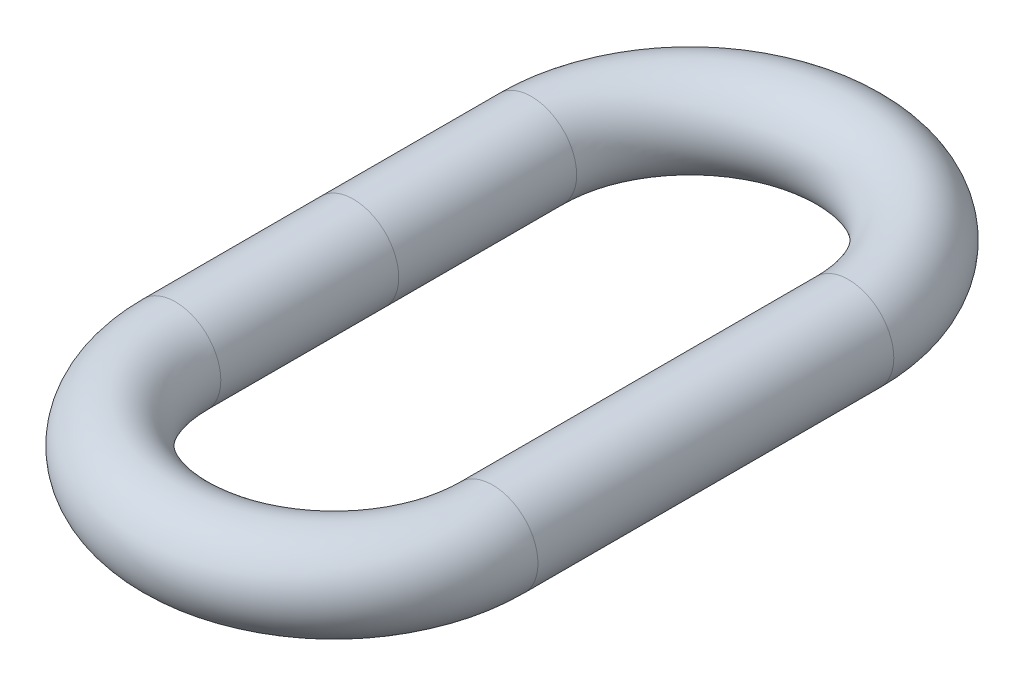
ISO-10303-21;
HEADER;
FILE_DESCRIPTION(('STEP AP214'),'2;1');
FILE_NAME('part.step','',(''),(''),'','','');
FILE_SCHEMA(('AUTOMOTIVE_DESIGN { 1 0 10303 214 1 1 1 1 }'));
ENDSEC;
DATA;
#1=APPLICATION_CONTEXT('core data for automotive mechanical design processes');
#2=APPLICATION_PROTOCOL_DEFINITION('international standard','automotive_design',2000,#1);
#3=PRODUCT_CONTEXT('',#1,'mechanical');
#4=PRODUCT('Part','Part','',(#3));
#5=PRODUCT_RELATED_PRODUCT_CATEGORY('part','',(#4));
#6=PRODUCT_DEFINITION_FORMATION('','',#4);
#7=PRODUCT_DEFINITION_CONTEXT('part definition',#1,'design');
#8=PRODUCT_DEFINITION('design','',#6,#7);
#9=PRODUCT_DEFINITION_SHAPE('','',#8);
#10=(LENGTH_UNIT() NAMED_UNIT(*) SI_UNIT(.MILLI.,.METRE.));
#11=(NAMED_UNIT(*) PLANE_ANGLE_UNIT() SI_UNIT($,.RADIAN.));
#12=(NAMED_UNIT(*) SI_UNIT($,.STERADIAN.) SOLID_ANGLE_UNIT());
#13=UNCERTAINTY_MEASURE_WITH_UNIT(LENGTH_MEASURE(1.E-05),#10,'distance_accuracy_value','');
#14=(GEOMETRIC_REPRESENTATION_CONTEXT(3) GLOBAL_UNCERTAINTY_ASSIGNED_CONTEXT((#13)) GLOBAL_UNIT_ASSIGNED_CONTEXT((#10,
#11,#12)) REPRESENTATION_CONTEXT('',''));
#15=CARTESIAN_POINT('',(0.,0.,0.));
#16=DIRECTION('',(0.,0.,1.));
#17=DIRECTION('',(1.,0.,0.));
#18=AXIS2_PLACEMENT_3D('',#15,#16,#17);
#19=CARTESIAN_POINT('',(-88.9,25.4,-99.7453308473433));
#20=DIRECTION('',(0.,0.,1.));
#21=DIRECTION('',(1.,0.,0.));
#22=AXIS2_PLACEMENT_3D('',#19,#20,#21);
#23=CYLINDRICAL_SURFACE('',#22,25.4);
#24=CARTESIAN_POINT('',(-88.9,25.4,0.));
#25=DIRECTION('',(0.,0.,1.));
#26=DIRECTION('',(1.,0.,0.));
#27=AXIS2_PLACEMENT_3D('',#24,#25,#26);
#28=CIRCLE('',#27,25.4);
#29=CARTESIAN_POINT('',(-63.5,25.4,0.));
#30=VERTEX_POINT('',#29);
#31=EDGE_CURVE('E56',#30,#30,#28,.T.);
#32=ORIENTED_EDGE('',*,*,#31,.F.);
#33=EDGE_LOOP('',(#32));
#34=FACE_BOUND('',#33,.T.);
#35=CARTESIAN_POINT('',(-88.9,25.4,-99.7453308473433));
#36=DIRECTION('',(0.,0.,1.));
#37=DIRECTION('',(1.,0.,0.));
#38=AXIS2_PLACEMENT_3D('',#35,#36,#37);
#39=CIRCLE('',#38,25.4);
#40=CARTESIAN_POINT('',(-114.3,25.4,-99.7453308473433));
#41=VERTEX_POINT('',#40);
#42=EDGE_CURVE('E10',#41,#41,#39,.T.);
#43=ORIENTED_EDGE('',*,*,#42,.T.);
#44=EDGE_LOOP('',(#43));
#45=FACE_BOUND('',#44,.T.);
#46=ADVANCED_FACE('F37',(#34,#45),#23,.T.);
#47=CARTESIAN_POINT('',(0.,25.4,-99.7453308473433));
#48=DIRECTION('',(0.,1.,0.));
#49=DIRECTION('',(0.,0.,1.));
#50=AXIS2_PLACEMENT_3D('',#47,#48,#49);
#51=TOROIDAL_SURFACE('',#50,88.9,25.4);
#52=CARTESIAN_POINT('',(88.9,25.4,-99.7453308473432));
#53=DIRECTION('',(0.,0.,-1.));
#54=DIRECTION('',(-1.,0.,0.));
#55=AXIS2_PLACEMENT_3D('',#52,#53,#54);
#56=CIRCLE('',#55,25.4);
#57=CARTESIAN_POINT('',(114.3,25.4,-99.7453308473432));
#58=VERTEX_POINT('',#57);
#59=EDGE_CURVE('E43',#58,#58,#56,.T.);
#60=CARTESIAN_POINT('',(0.,25.4,-99.7453308473433));
#61=DIRECTION('',(0.,1.,0.));
#62=DIRECTION('',(0.,0.,1.));
#63=AXIS2_PLACEMENT_3D('',#60,#61,#62);
#64=CIRCLE('',#63,114.3);
#65=EDGE_CURVE('',#58,#41,#64,.T.);
#66=ORIENTED_EDGE('',*,*,#59,.T.);
#67=ORIENTED_EDGE('',*,*,#42,.F.);
#68=ORIENTED_EDGE('',*,*,#65,.T.);
#69=ORIENTED_EDGE('',*,*,#65,.F.);
#70=EDGE_LOOP('',(#66,#68,#67,#69));
#71=FACE_BOUND('',#70,.T.);
#72=ADVANCED_FACE('F63',(#71),#51,.T.);
#73=CARTESIAN_POINT('',(88.9,25.4,99.7453308473433));
#74=DIRECTION('',(0.,0.,-1.));
#75=DIRECTION('',(-1.,0.,0.));
#76=AXIS2_PLACEMENT_3D('',#73,#74,#75);
#77=CYLINDRICAL_SURFACE('',#76,25.4);
#78=ORIENTED_EDGE('',*,*,#59,.F.);
#79=EDGE_LOOP('',(#78));
#80=FACE_BOUND('',#79,.T.);
#81=CARTESIAN_POINT('',(88.9,25.4,99.7453308473433));
#82=DIRECTION('',(0.,0.,-1.));
#83=DIRECTION('',(-1.,0.,0.));
#84=AXIS2_PLACEMENT_3D('',#81,#82,#83);
#85=CIRCLE('',#84,25.4);
#86=CARTESIAN_POINT('',(114.3,25.4,99.7453308473433));
#87=VERTEX_POINT('',#86);
#88=EDGE_CURVE('E47',#87,#87,#85,.T.);
#89=ORIENTED_EDGE('',*,*,#88,.T.);
#90=EDGE_LOOP('',(#89));
#91=FACE_BOUND('',#90,.T.);
#92=ADVANCED_FACE('F67',(#80,#91),#77,.T.);
#93=CARTESIAN_POINT('',(0.,25.4,99.7453308473433));
#94=DIRECTION('',(0.,1.,0.));
#95=DIRECTION('',(0.,0.,1.));
#96=AXIS2_PLACEMENT_3D('',#93,#94,#95);
#97=TOROIDAL_SURFACE('',#96,88.9,25.4);
#98=CARTESIAN_POINT('',(-88.9,25.4,99.7453308473433));
#99=DIRECTION('',(0.,0.,1.));
#100=DIRECTION('',(1.,0.,0.));
#101=AXIS2_PLACEMENT_3D('',#98,#99,#100);
#102=CIRCLE('',#101,25.4);
#103=CARTESIAN_POINT('',(-114.3,25.4,99.7453308473433));
#104=VERTEX_POINT('',#103);
#105=EDGE_CURVE('E51',#104,#104,#102,.T.);
#106=CARTESIAN_POINT('',(0.,25.4,99.7453308473433));
#107=DIRECTION('',(0.,1.,0.));
#108=DIRECTION('',(0.,0.,1.));
#109=AXIS2_PLACEMENT_3D('',#106,#107,#108);
#110=CIRCLE('',#109,114.3);
#111=EDGE_CURVE('',#104,#87,#110,.T.);
#112=ORIENTED_EDGE('',*,*,#105,.T.);
#113=ORIENTED_EDGE('',*,*,#88,.F.);
#114=ORIENTED_EDGE('',*,*,#111,.T.);
#115=ORIENTED_EDGE('',*,*,#111,.F.);
#116=EDGE_LOOP('',(#112,#114,#113,#115));
#117=FACE_BOUND('',#116,.T.);
#118=ADVANCED_FACE('F72',(#117),#97,.T.);
#119=CARTESIAN_POINT('',(-88.9,25.4,0.));
#120=DIRECTION('',(0.,0.,1.));
#121=DIRECTION('',(1.,0.,0.));
#122=AXIS2_PLACEMENT_3D('',#119,#120,#121);
#123=CYLINDRICAL_SURFACE('',#122,25.4);
#124=ORIENTED_EDGE('',*,*,#105,.F.);
#125=EDGE_LOOP('',(#124));
#126=FACE_BOUND('',#125,.T.);
#127=ORIENTED_EDGE('',*,*,#31,.T.);
#128=EDGE_LOOP('',(#127));
#129=FACE_BOUND('',#128,.T.);
#130=ADVANCED_FACE('F60',(#126,#129),#123,.T.);
#131=CLOSED_SHELL('',(#46,#72,#92,#118,#130));
#132=MANIFOLD_SOLID_BREP('B2',#131);
#133=ADVANCED_BREP_SHAPE_REPRESENTATION('',(#18,#132),#14);
#134=SHAPE_DEFINITION_REPRESENTATION(#9,#133);
ENDSEC;
END-ISO-10303-21;
